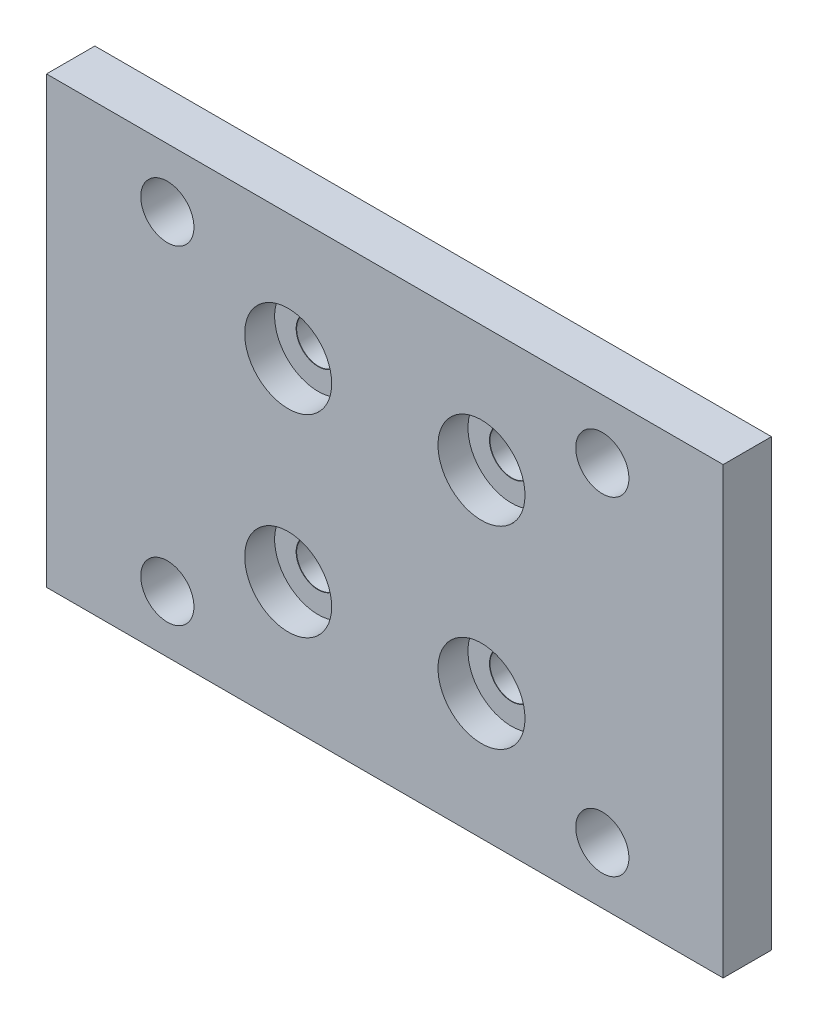
ISO-10303-21;
HEADER;
FILE_DESCRIPTION(('STEP AP214'),'2;1');
FILE_NAME('part.step','',(''),(''),'','','');
FILE_SCHEMA(('AUTOMOTIVE_DESIGN { 1 0 10303 214 1 1 1 1 }'));
ENDSEC;
DATA;
#1=APPLICATION_CONTEXT('core data for automotive mechanical design processes');
#2=APPLICATION_PROTOCOL_DEFINITION('international standard','automotive_design',2000,#1);
#3=PRODUCT_CONTEXT('',#1,'mechanical');
#4=PRODUCT('Part','Part','',(#3));
#5=PRODUCT_RELATED_PRODUCT_CATEGORY('part','',(#4));
#6=PRODUCT_DEFINITION_FORMATION('','',#4);
#7=PRODUCT_DEFINITION_CONTEXT('part definition',#1,'design');
#8=PRODUCT_DEFINITION('design','',#6,#7);
#9=PRODUCT_DEFINITION_SHAPE('','',#8);
#10=(LENGTH_UNIT() NAMED_UNIT(*) SI_UNIT(.MILLI.,.METRE.));
#11=(NAMED_UNIT(*) PLANE_ANGLE_UNIT() SI_UNIT($,.RADIAN.));
#12=(NAMED_UNIT(*) SI_UNIT($,.STERADIAN.) SOLID_ANGLE_UNIT());
#13=UNCERTAINTY_MEASURE_WITH_UNIT(LENGTH_MEASURE(1.E-05),#10,'distance_accuracy_value','');
#14=(GEOMETRIC_REPRESENTATION_CONTEXT(3) GLOBAL_UNCERTAINTY_ASSIGNED_CONTEXT((#13)) GLOBAL_UNIT_ASSIGNED_CONTEXT((#10,
#11,#12)) REPRESENTATION_CONTEXT('',''));
#15=CARTESIAN_POINT('',(0.,0.,0.));
#16=DIRECTION('',(0.,0.,1.));
#17=DIRECTION('',(1.,0.,0.));
#18=AXIS2_PLACEMENT_3D('',#15,#16,#17);
#19=CARTESIAN_POINT('',(35.,-23.,5.));
#20=DIRECTION('',(-1.,0.,0.));
#21=DIRECTION('',(0.,0.,1.));
#22=AXIS2_PLACEMENT_3D('',#19,#20,#21);
#23=PLANE('',#22);
#24=DIRECTION('',(0.,1.,0.));
#25=VECTOR('',#24,1.);
#26=CARTESIAN_POINT('',(35.,-23.,0.));
#27=LINE('',#26,#25);
#28=CARTESIAN_POINT('',(35.,-23.,0.));
#29=VERTEX_POINT('',#28);
#30=CARTESIAN_POINT('',(35.,23.,0.));
#31=VERTEX_POINT('',#30);
#32=EDGE_CURVE('E97',#29,#31,#27,.T.);
#33=ORIENTED_EDGE('',*,*,#32,.T.);
#34=DIRECTION('',(0.,0.,-1.));
#35=VECTOR('',#34,1.);
#36=CARTESIAN_POINT('',(35.,23.,5.));
#37=LINE('',#36,#35);
#38=CARTESIAN_POINT('',(35.,23.,5.));
#39=VERTEX_POINT('',#38);
#40=EDGE_CURVE('E11',#39,#31,#37,.T.);
#41=ORIENTED_EDGE('',*,*,#40,.F.);
#42=DIRECTION('',(0.,1.,0.));
#43=VECTOR('',#42,1.);
#44=CARTESIAN_POINT('',(35.,-23.,5.));
#45=LINE('',#44,#43);
#46=CARTESIAN_POINT('',(35.,-23.,5.));
#47=VERTEX_POINT('',#46);
#48=EDGE_CURVE('E85',#47,#39,#45,.T.);
#49=ORIENTED_EDGE('',*,*,#48,.F.);
#50=DIRECTION('',(0.,0.,-1.));
#51=VECTOR('',#50,1.);
#52=CARTESIAN_POINT('',(35.,-23.,5.));
#53=LINE('',#52,#51);
#54=EDGE_CURVE('E93',#47,#29,#53,.T.);
#55=ORIENTED_EDGE('',*,*,#54,.T.);
#56=EDGE_LOOP('',(#33,#41,#49,#55));
#57=FACE_BOUND('',#56,.T.);
#58=ADVANCED_FACE('F34',(#57),#23,.F.);
#59=CARTESIAN_POINT('',(-35.,23.,5.));
#60=DIRECTION('',(0.,-1.,0.));
#61=DIRECTION('',(0.,0.,-1.));
#62=AXIS2_PLACEMENT_3D('',#59,#60,#61);
#63=PLANE('',#62);
#64=DIRECTION('',(-1.,0.,0.));
#65=VECTOR('',#64,1.);
#66=CARTESIAN_POINT('',(-35.,23.,0.));
#67=LINE('',#66,#65);
#68=CARTESIAN_POINT('',(-35.,23.,0.));
#69=VERTEX_POINT('',#68);
#70=EDGE_CURVE('E89',#31,#69,#67,.T.);
#71=ORIENTED_EDGE('',*,*,#70,.T.);
#72=DIRECTION('',(0.,0.,-1.));
#73=VECTOR('',#72,1.);
#74=CARTESIAN_POINT('',(-35.,23.,5.));
#75=LINE('',#74,#73);
#76=CARTESIAN_POINT('',(-35.,23.,5.));
#77=VERTEX_POINT('',#76);
#78=EDGE_CURVE('E42',#77,#69,#75,.T.);
#79=ORIENTED_EDGE('',*,*,#78,.F.);
#80=DIRECTION('',(-1.,0.,0.));
#81=VECTOR('',#80,1.);
#82=CARTESIAN_POINT('',(-35.,23.,5.));
#83=LINE('',#82,#81);
#84=EDGE_CURVE('E80',#39,#77,#83,.T.);
#85=ORIENTED_EDGE('',*,*,#84,.F.);
#86=ORIENTED_EDGE('',*,*,#40,.T.);
#87=EDGE_LOOP('',(#71,#79,#85,#86));
#88=FACE_BOUND('',#87,.T.);
#89=ADVANCED_FACE('F88',(#88),#63,.F.);
#90=CARTESIAN_POINT('',(-35.,-23.,5.));
#91=DIRECTION('',(1.,0.,0.));
#92=DIRECTION('',(0.,0.,-1.));
#93=AXIS2_PLACEMENT_3D('',#90,#91,#92);
#94=PLANE('',#93);
#95=DIRECTION('',(0.,-1.,0.));
#96=VECTOR('',#95,1.);
#97=CARTESIAN_POINT('',(-35.,-23.,0.));
#98=LINE('',#97,#96);
#99=CARTESIAN_POINT('',(-35.,-23.,0.));
#100=VERTEX_POINT('',#99);
#101=EDGE_CURVE('E67',#69,#100,#98,.T.);
#102=ORIENTED_EDGE('',*,*,#101,.T.);
#103=DIRECTION('',(0.,0.,-1.));
#104=VECTOR('',#103,1.);
#105=CARTESIAN_POINT('',(-35.,-23.,5.));
#106=LINE('',#105,#104);
#107=CARTESIAN_POINT('',(-35.,-23.,5.));
#108=VERTEX_POINT('',#107);
#109=EDGE_CURVE('E90',#108,#100,#106,.T.);
#110=ORIENTED_EDGE('',*,*,#109,.F.);
#111=DIRECTION('',(0.,-1.,0.));
#112=VECTOR('',#111,1.);
#113=CARTESIAN_POINT('',(-35.,-23.,5.));
#114=LINE('',#113,#112);
#115=EDGE_CURVE('E83',#77,#108,#114,.T.);
#116=ORIENTED_EDGE('',*,*,#115,.F.);
#117=ORIENTED_EDGE('',*,*,#78,.T.);
#118=EDGE_LOOP('',(#102,#110,#116,#117));
#119=FACE_BOUND('',#118,.T.);
#120=ADVANCED_FACE('F91',(#119),#94,.F.);
#121=CARTESIAN_POINT('',(-35.,-23.,5.));
#122=DIRECTION('',(0.,1.,0.));
#123=DIRECTION('',(0.,0.,1.));
#124=AXIS2_PLACEMENT_3D('',#121,#122,#123);
#125=PLANE('',#124);
#126=DIRECTION('',(1.,0.,0.));
#127=VECTOR('',#126,1.);
#128=CARTESIAN_POINT('',(-35.,-23.,0.));
#129=LINE('',#128,#127);
#130=EDGE_CURVE('E73',#100,#29,#129,.T.);
#131=ORIENTED_EDGE('',*,*,#130,.T.);
#132=ORIENTED_EDGE('',*,*,#54,.F.);
#133=DIRECTION('',(1.,0.,0.));
#134=VECTOR('',#133,1.);
#135=CARTESIAN_POINT('',(-35.,-23.,5.));
#136=LINE('',#135,#134);
#137=EDGE_CURVE('E50',#108,#47,#136,.T.);
#138=ORIENTED_EDGE('',*,*,#137,.F.);
#139=ORIENTED_EDGE('',*,*,#109,.T.);
#140=EDGE_LOOP('',(#131,#132,#138,#139));
#141=FACE_BOUND('',#140,.T.);
#142=ADVANCED_FACE('F105',(#141),#125,.F.);
#143=CARTESIAN_POINT('',(0.,0.,5.));
#144=DIRECTION('',(0.,0.,-1.));
#145=DIRECTION('',(-1.,0.,0.));
#146=AXIS2_PLACEMENT_3D('',#143,#144,#145);
#147=PLANE('',#146);
#148=CARTESIAN_POINT('',(-9.99999999999564,-10.0000000000003,5.));
#149=DIRECTION('',(0.,0.,1.));
#150=DIRECTION('',(1.,0.,0.));
#151=AXIS2_PLACEMENT_3D('',#148,#149,#150);
#152=CIRCLE('',#151,4.49999999999999);
#153=CARTESIAN_POINT('',(-5.49999999999564,-10.0000000000003,5.));
#154=VERTEX_POINT('',#153);
#155=EDGE_CURVE('E191',#154,#154,#152,.T.);
#156=ORIENTED_EDGE('',*,*,#155,.F.);
#157=EDGE_LOOP('',(#156));
#158=FACE_BOUND('',#157,.T.);
#159=CARTESIAN_POINT('',(-9.99999999999583,9.99999999999973,5.));
#160=DIRECTION('',(0.,0.,1.));
#161=DIRECTION('',(1.,0.,0.));
#162=AXIS2_PLACEMENT_3D('',#159,#160,#161);
#163=CIRCLE('',#162,4.49999999999999);
#164=CARTESIAN_POINT('',(-5.49999999999584,9.99999999999973,5.));
#165=VERTEX_POINT('',#164);
#166=EDGE_CURVE('E179',#165,#165,#163,.T.);
#167=ORIENTED_EDGE('',*,*,#166,.F.);
#168=EDGE_LOOP('',(#167));
#169=FACE_BOUND('',#168,.T.);
#170=CARTESIAN_POINT('',(10.0000000000042,9.99999999999992,5.));
#171=DIRECTION('',(0.,0.,1.));
#172=DIRECTION('',(1.,0.,0.));
#173=AXIS2_PLACEMENT_3D('',#170,#171,#172);
#174=CIRCLE('',#173,4.49999999999999);
#175=CARTESIAN_POINT('',(14.5000000000042,9.99999999999992,5.));
#176=VERTEX_POINT('',#175);
#177=EDGE_CURVE('E167',#176,#176,#174,.T.);
#178=ORIENTED_EDGE('',*,*,#177,.F.);
#179=EDGE_LOOP('',(#178));
#180=FACE_BOUND('',#179,.T.);
#181=CARTESIAN_POINT('',(10.0000000000044,-10.0000000000001,5.));
#182=DIRECTION('',(0.,0.,1.));
#183=DIRECTION('',(1.,0.,0.));
#184=AXIS2_PLACEMENT_3D('',#181,#182,#183);
#185=CIRCLE('',#184,4.49999999999999);
#186=CARTESIAN_POINT('',(14.5000000000044,-10.0000000000001,5.));
#187=VERTEX_POINT('',#186);
#188=EDGE_CURVE('E155',#187,#187,#185,.T.);
#189=ORIENTED_EDGE('',*,*,#188,.F.);
#190=EDGE_LOOP('',(#189));
#191=FACE_BOUND('',#190,.T.);
#192=CARTESIAN_POINT('',(22.5000000000002,-17.1164265716955,5.));
#193=DIRECTION('',(0.,0.,1.));
#194=DIRECTION('',(1.,0.,0.));
#195=AXIS2_PLACEMENT_3D('',#192,#193,#194);
#196=CIRCLE('',#195,2.75);
#197=CARTESIAN_POINT('',(25.2500000000002,-17.1164265716955,5.));
#198=VERTEX_POINT('',#197);
#199=EDGE_CURVE('E131',#198,#198,#196,.T.);
#200=ORIENTED_EDGE('',*,*,#199,.F.);
#201=EDGE_LOOP('',(#200));
#202=FACE_BOUND('',#201,.T.);
#203=CARTESIAN_POINT('',(22.5000000000002,16.8835734283045,5.));
#204=DIRECTION('',(0.,0.,1.));
#205=DIRECTION('',(1.,0.,0.));
#206=AXIS2_PLACEMENT_3D('',#203,#204,#205);
#207=CIRCLE('',#206,2.75);
#208=CARTESIAN_POINT('',(25.2500000000002,16.8835734283045,5.));
#209=VERTEX_POINT('',#208);
#210=EDGE_CURVE('E125',#209,#209,#207,.T.);
#211=ORIENTED_EDGE('',*,*,#210,.F.);
#212=EDGE_LOOP('',(#211));
#213=FACE_BOUND('',#212,.T.);
#214=CARTESIAN_POINT('',(-22.4999999999997,16.8835734283045,5.));
#215=DIRECTION('',(0.,0.,1.));
#216=DIRECTION('',(1.,0.,0.));
#217=AXIS2_PLACEMENT_3D('',#214,#215,#216);
#218=CIRCLE('',#217,2.75);
#219=CARTESIAN_POINT('',(-19.7499999999997,16.8835734283045,5.));
#220=VERTEX_POINT('',#219);
#221=EDGE_CURVE('E119',#220,#220,#218,.T.);
#222=ORIENTED_EDGE('',*,*,#221,.F.);
#223=EDGE_LOOP('',(#222));
#224=FACE_BOUND('',#223,.T.);
#225=CARTESIAN_POINT('',(-22.4999999999997,-17.1164265716955,5.));
#226=DIRECTION('',(0.,0.,1.));
#227=DIRECTION('',(1.,0.,0.));
#228=AXIS2_PLACEMENT_3D('',#225,#226,#227);
#229=CIRCLE('',#228,2.75);
#230=CARTESIAN_POINT('',(-19.7499999999997,-17.1164265716955,5.));
#231=VERTEX_POINT('',#230);
#232=EDGE_CURVE('E113',#231,#231,#229,.T.);
#233=ORIENTED_EDGE('',*,*,#232,.F.);
#234=EDGE_LOOP('',(#233));
#235=FACE_BOUND('',#234,.T.);
#236=ORIENTED_EDGE('',*,*,#48,.T.);
#237=ORIENTED_EDGE('',*,*,#84,.T.);
#238=ORIENTED_EDGE('',*,*,#115,.T.);
#239=ORIENTED_EDGE('',*,*,#137,.T.);
#240=EDGE_LOOP('',(#236,#237,#238,#239));
#241=FACE_BOUND('',#240,.T.);
#242=ADVANCED_FACE('F81',(#158,#169,#180,#191,#202,#213,#224,#235,#241),#147,.F.);
#243=CARTESIAN_POINT('',(0.,0.,0.));
#244=DIRECTION('',(0.,0.,-1.));
#245=DIRECTION('',(-1.,0.,0.));
#246=AXIS2_PLACEMENT_3D('',#243,#244,#245);
#247=PLANE('',#246);
#248=CARTESIAN_POINT('',(-9.99999999999564,-10.0000000000003,0.));
#249=DIRECTION('',(0.,0.,-1.));
#250=DIRECTION('',(-1.,0.,0.));
#251=AXIS2_PLACEMENT_3D('',#248,#249,#250);
#252=CIRCLE('',#251,2.25);
#253=CARTESIAN_POINT('',(-12.2499999999956,-10.0000000000003,0.));
#254=VERTEX_POINT('',#253);
#255=EDGE_CURVE('E143',#254,#254,#252,.T.);
#256=ORIENTED_EDGE('',*,*,#255,.F.);
#257=EDGE_LOOP('',(#256));
#258=FACE_BOUND('',#257,.T.);
#259=CARTESIAN_POINT('',(10.0000000000044,-10.0000000000001,0.));
#260=DIRECTION('',(0.,0.,-1.));
#261=DIRECTION('',(-1.,0.,0.));
#262=AXIS2_PLACEMENT_3D('',#259,#260,#261);
#263=CIRCLE('',#262,2.25);
#264=CARTESIAN_POINT('',(7.75000000000436,-10.0000000000001,0.));
#265=VERTEX_POINT('',#264);
#266=EDGE_CURVE('E140',#265,#265,#263,.T.);
#267=ORIENTED_EDGE('',*,*,#266,.F.);
#268=EDGE_LOOP('',(#267));
#269=FACE_BOUND('',#268,.T.);
#270=CARTESIAN_POINT('',(10.0000000000042,9.99999999999992,0.));
#271=DIRECTION('',(0.,0.,-1.));
#272=DIRECTION('',(-1.,0.,0.));
#273=AXIS2_PLACEMENT_3D('',#270,#271,#272);
#274=CIRCLE('',#273,2.25);
#275=CARTESIAN_POINT('',(7.75000000000416,9.99999999999992,0.));
#276=VERTEX_POINT('',#275);
#277=EDGE_CURVE('E137',#276,#276,#274,.T.);
#278=ORIENTED_EDGE('',*,*,#277,.F.);
#279=EDGE_LOOP('',(#278));
#280=FACE_BOUND('',#279,.T.);
#281=CARTESIAN_POINT('',(-9.99999999999583,9.99999999999973,0.));
#282=DIRECTION('',(0.,0.,-1.));
#283=DIRECTION('',(-1.,0.,0.));
#284=AXIS2_PLACEMENT_3D('',#281,#282,#283);
#285=CIRCLE('',#284,2.25);
#286=CARTESIAN_POINT('',(-12.2499999999958,9.99999999999973,0.));
#287=VERTEX_POINT('',#286);
#288=EDGE_CURVE('E134',#287,#287,#285,.T.);
#289=ORIENTED_EDGE('',*,*,#288,.F.);
#290=EDGE_LOOP('',(#289));
#291=FACE_BOUND('',#290,.T.);
#292=CARTESIAN_POINT('',(22.5000000000002,-17.1164265716955,0.));
#293=DIRECTION('',(0.,0.,1.));
#294=DIRECTION('',(1.,0.,0.));
#295=AXIS2_PLACEMENT_3D('',#292,#293,#294);
#296=CIRCLE('',#295,2.75);
#297=CARTESIAN_POINT('',(25.2500000000002,-17.1164265716955,0.));
#298=VERTEX_POINT('',#297);
#299=EDGE_CURVE('E128',#298,#298,#296,.T.);
#300=ORIENTED_EDGE('',*,*,#299,.T.);
#301=EDGE_LOOP('',(#300));
#302=FACE_BOUND('',#301,.T.);
#303=CARTESIAN_POINT('',(22.5000000000002,16.8835734283045,0.));
#304=DIRECTION('',(0.,0.,1.));
#305=DIRECTION('',(1.,0.,0.));
#306=AXIS2_PLACEMENT_3D('',#303,#304,#305);
#307=CIRCLE('',#306,2.75);
#308=CARTESIAN_POINT('',(25.2500000000002,16.8835734283045,0.));
#309=VERTEX_POINT('',#308);
#310=EDGE_CURVE('E122',#309,#309,#307,.T.);
#311=ORIENTED_EDGE('',*,*,#310,.T.);
#312=EDGE_LOOP('',(#311));
#313=FACE_BOUND('',#312,.T.);
#314=CARTESIAN_POINT('',(-22.4999999999997,16.8835734283045,0.));
#315=DIRECTION('',(0.,0.,1.));
#316=DIRECTION('',(1.,0.,0.));
#317=AXIS2_PLACEMENT_3D('',#314,#315,#316);
#318=CIRCLE('',#317,2.75);
#319=CARTESIAN_POINT('',(-19.7499999999997,16.8835734283045,0.));
#320=VERTEX_POINT('',#319);
#321=EDGE_CURVE('E116',#320,#320,#318,.T.);
#322=ORIENTED_EDGE('',*,*,#321,.T.);
#323=EDGE_LOOP('',(#322));
#324=FACE_BOUND('',#323,.T.);
#325=CARTESIAN_POINT('',(-22.4999999999997,-17.1164265716955,0.));
#326=DIRECTION('',(0.,0.,1.));
#327=DIRECTION('',(1.,0.,0.));
#328=AXIS2_PLACEMENT_3D('',#325,#326,#327);
#329=CIRCLE('',#328,2.75);
#330=CARTESIAN_POINT('',(-19.7499999999997,-17.1164265716955,0.));
#331=VERTEX_POINT('',#330);
#332=EDGE_CURVE('E100',#331,#331,#329,.T.);
#333=ORIENTED_EDGE('',*,*,#332,.T.);
#334=EDGE_LOOP('',(#333));
#335=FACE_BOUND('',#334,.T.);
#336=ORIENTED_EDGE('',*,*,#32,.F.);
#337=ORIENTED_EDGE('',*,*,#130,.F.);
#338=ORIENTED_EDGE('',*,*,#101,.F.);
#339=ORIENTED_EDGE('',*,*,#70,.F.);
#340=EDGE_LOOP('',(#336,#337,#338,#339));
#341=FACE_BOUND('',#340,.T.);
#342=ADVANCED_FACE('F108',(#258,#269,#280,#291,#302,#313,#324,#335,#341),#247,.T.);
#343=CARTESIAN_POINT('',(-22.4999999999997,-17.1164265716955,5.));
#344=DIRECTION('',(0.,0.,1.));
#345=DIRECTION('',(1.,0.,0.));
#346=AXIS2_PLACEMENT_3D('',#343,#344,#345);
#347=CYLINDRICAL_SURFACE('',#346,2.75);
#348=ORIENTED_EDGE('',*,*,#332,.F.);
#349=EDGE_LOOP('',(#348));
#350=FACE_BOUND('',#349,.T.);
#351=ORIENTED_EDGE('',*,*,#232,.T.);
#352=EDGE_LOOP('',(#351));
#353=FACE_BOUND('',#352,.T.);
#354=ADVANCED_FACE('F214',(#350,#353),#347,.F.);
#355=CARTESIAN_POINT('',(-22.4999999999997,16.8835734283045,5.));
#356=DIRECTION('',(0.,0.,1.));
#357=DIRECTION('',(1.,0.,0.));
#358=AXIS2_PLACEMENT_3D('',#355,#356,#357);
#359=CYLINDRICAL_SURFACE('',#358,2.75);
#360=ORIENTED_EDGE('',*,*,#321,.F.);
#361=EDGE_LOOP('',(#360));
#362=FACE_BOUND('',#361,.T.);
#363=ORIENTED_EDGE('',*,*,#221,.T.);
#364=EDGE_LOOP('',(#363));
#365=FACE_BOUND('',#364,.T.);
#366=ADVANCED_FACE('F216',(#362,#365),#359,.F.);
#367=CARTESIAN_POINT('',(22.5000000000002,16.8835734283045,5.));
#368=DIRECTION('',(0.,0.,1.));
#369=DIRECTION('',(1.,0.,0.));
#370=AXIS2_PLACEMENT_3D('',#367,#368,#369);
#371=CYLINDRICAL_SURFACE('',#370,2.75);
#372=ORIENTED_EDGE('',*,*,#310,.F.);
#373=EDGE_LOOP('',(#372));
#374=FACE_BOUND('',#373,.T.);
#375=ORIENTED_EDGE('',*,*,#210,.T.);
#376=EDGE_LOOP('',(#375));
#377=FACE_BOUND('',#376,.T.);
#378=ADVANCED_FACE('F223',(#374,#377),#371,.F.);
#379=CARTESIAN_POINT('',(22.5000000000002,-17.1164265716955,5.));
#380=DIRECTION('',(0.,0.,1.));
#381=DIRECTION('',(1.,0.,0.));
#382=AXIS2_PLACEMENT_3D('',#379,#380,#381);
#383=CYLINDRICAL_SURFACE('',#382,2.75);
#384=ORIENTED_EDGE('',*,*,#299,.F.);
#385=EDGE_LOOP('',(#384));
#386=FACE_BOUND('',#385,.T.);
#387=ORIENTED_EDGE('',*,*,#199,.T.);
#388=EDGE_LOOP('',(#387));
#389=FACE_BOUND('',#388,.T.);
#390=ADVANCED_FACE('F258',(#386,#389),#383,.F.);
#391=CARTESIAN_POINT('',(-9.99999999999583,9.99999999999973,0.));
#392=DIRECTION('',(0.,0.,-1.));
#393=DIRECTION('',(-1.,0.,0.));
#394=AXIS2_PLACEMENT_3D('',#391,#392,#393);
#395=CYLINDRICAL_SURFACE('',#394,2.25);
#396=CARTESIAN_POINT('',(-9.99999999999583,9.99999999999973,1.875));
#397=DIRECTION('',(0.,0.,1.));
#398=DIRECTION('',(1.,0.,0.));
#399=AXIS2_PLACEMENT_3D('',#396,#397,#398);
#400=CIRCLE('',#399,2.25);
#401=CARTESIAN_POINT('',(-7.74999999999583,9.99999999999973,1.875));
#402=VERTEX_POINT('',#401);
#403=EDGE_CURVE('E170',#402,#402,#400,.T.);
#404=ORIENTED_EDGE('',*,*,#403,.T.);
#405=EDGE_LOOP('',(#404));
#406=FACE_BOUND('',#405,.T.);
#407=ORIENTED_EDGE('',*,*,#288,.T.);
#408=EDGE_LOOP('',(#407));
#409=FACE_BOUND('',#408,.T.);
#410=ADVANCED_FACE('F263',(#406,#409),#395,.F.);
#411=CARTESIAN_POINT('',(10.0000000000042,9.99999999999992,0.));
#412=DIRECTION('',(0.,0.,-1.));
#413=DIRECTION('',(-1.,0.,0.));
#414=AXIS2_PLACEMENT_3D('',#411,#412,#413);
#415=CYLINDRICAL_SURFACE('',#414,2.25);
#416=CARTESIAN_POINT('',(10.0000000000042,9.99999999999992,1.875));
#417=DIRECTION('',(0.,0.,1.));
#418=DIRECTION('',(1.,0.,0.));
#419=AXIS2_PLACEMENT_3D('',#416,#417,#418);
#420=CIRCLE('',#419,2.25);
#421=CARTESIAN_POINT('',(12.2500000000042,9.99999999999992,1.875));
#422=VERTEX_POINT('',#421);
#423=EDGE_CURVE('E158',#422,#422,#420,.T.);
#424=ORIENTED_EDGE('',*,*,#423,.T.);
#425=EDGE_LOOP('',(#424));
#426=FACE_BOUND('',#425,.T.);
#427=ORIENTED_EDGE('',*,*,#277,.T.);
#428=EDGE_LOOP('',(#427));
#429=FACE_BOUND('',#428,.T.);
#430=ADVANCED_FACE('F292',(#426,#429),#415,.F.);
#431=CARTESIAN_POINT('',(10.0000000000044,-10.0000000000001,0.));
#432=DIRECTION('',(0.,0.,-1.));
#433=DIRECTION('',(-1.,0.,0.));
#434=AXIS2_PLACEMENT_3D('',#431,#432,#433);
#435=CYLINDRICAL_SURFACE('',#434,2.25);
#436=CARTESIAN_POINT('',(10.0000000000044,-10.0000000000001,1.875));
#437=DIRECTION('',(0.,0.,1.));
#438=DIRECTION('',(1.,0.,0.));
#439=AXIS2_PLACEMENT_3D('',#436,#437,#438);
#440=CIRCLE('',#439,2.25);
#441=CARTESIAN_POINT('',(12.2500000000044,-10.0000000000001,1.875));
#442=VERTEX_POINT('',#441);
#443=EDGE_CURVE('E146',#442,#442,#440,.T.);
#444=ORIENTED_EDGE('',*,*,#443,.T.);
#445=EDGE_LOOP('',(#444));
#446=FACE_BOUND('',#445,.T.);
#447=ORIENTED_EDGE('',*,*,#266,.T.);
#448=EDGE_LOOP('',(#447));
#449=FACE_BOUND('',#448,.T.);
#450=ADVANCED_FACE('F296',(#446,#449),#435,.F.);
#451=CARTESIAN_POINT('',(-9.99999999999564,-10.0000000000003,0.));
#452=DIRECTION('',(0.,0.,-1.));
#453=DIRECTION('',(-1.,0.,0.));
#454=AXIS2_PLACEMENT_3D('',#451,#452,#453);
#455=CYLINDRICAL_SURFACE('',#454,2.25);
#456=CARTESIAN_POINT('',(-9.99999999999564,-10.0000000000003,1.875));
#457=DIRECTION('',(0.,0.,1.));
#458=DIRECTION('',(1.,0.,0.));
#459=AXIS2_PLACEMENT_3D('',#456,#457,#458);
#460=CIRCLE('',#459,2.25);
#461=CARTESIAN_POINT('',(-7.74999999999564,-10.0000000000003,1.875));
#462=VERTEX_POINT('',#461);
#463=EDGE_CURVE('E182',#462,#462,#460,.T.);
#464=ORIENTED_EDGE('',*,*,#463,.T.);
#465=EDGE_LOOP('',(#464));
#466=FACE_BOUND('',#465,.T.);
#467=ORIENTED_EDGE('',*,*,#255,.T.);
#468=EDGE_LOOP('',(#467));
#469=FACE_BOUND('',#468,.T.);
#470=ADVANCED_FACE('F300',(#466,#469),#455,.F.);
#471=CARTESIAN_POINT('',(10.0000000000044,-10.0000000000001,1.9));
#472=DIRECTION('',(0.,0.,1.));
#473=DIRECTION('',(1.,0.,0.));
#474=AXIS2_PLACEMENT_3D('',#471,#472,#473);
#475=CONICAL_SURFACE('',#474,2.275,0.785398163397483);
#476=ORIENTED_EDGE('',*,*,#443,.F.);
#477=EDGE_LOOP('',(#476));
#478=FACE_BOUND('',#477,.T.);
#479=CARTESIAN_POINT('',(10.0000000000044,-10.0000000000001,1.9));
#480=DIRECTION('',(0.,0.,1.));
#481=DIRECTION('',(1.,0.,0.));
#482=AXIS2_PLACEMENT_3D('',#479,#480,#481);
#483=CIRCLE('',#482,2.275);
#484=CARTESIAN_POINT('',(12.2750000000044,-10.0000000000001,1.9));
#485=VERTEX_POINT('',#484);
#486=EDGE_CURVE('E149',#485,#485,#483,.T.);
#487=ORIENTED_EDGE('',*,*,#486,.T.);
#488=EDGE_LOOP('',(#487));
#489=FACE_BOUND('',#488,.T.);
#490=ADVANCED_FACE('F304',(#478,#489),#475,.F.);
#491=CARTESIAN_POINT('',(12.2750000000044,-10.0000000000001,1.9));
#492=DIRECTION('',(0.,0.,-1.));
#493=DIRECTION('',(-1.,0.,0.));
#494=AXIS2_PLACEMENT_3D('',#491,#492,#493);
#495=PLANE('',#494);
#496=ORIENTED_EDGE('',*,*,#486,.F.);
#497=EDGE_LOOP('',(#496));
#498=FACE_BOUND('',#497,.T.);
#499=CARTESIAN_POINT('',(10.0000000000044,-10.0000000000001,1.9));
#500=DIRECTION('',(0.,0.,1.));
#501=DIRECTION('',(1.,0.,0.));
#502=AXIS2_PLACEMENT_3D('',#499,#500,#501);
#503=CIRCLE('',#502,4.49999999999999);
#504=CARTESIAN_POINT('',(14.5000000000044,-10.0000000000001,1.9));
#505=VERTEX_POINT('',#504);
#506=EDGE_CURVE('E152',#505,#505,#503,.T.);
#507=ORIENTED_EDGE('',*,*,#506,.T.);
#508=EDGE_LOOP('',(#507));
#509=FACE_BOUND('',#508,.T.);
#510=ADVANCED_FACE('F308',(#498,#509),#495,.F.);
#511=CARTESIAN_POINT('',(10.0000000000044,-10.0000000000001,5.));
#512=DIRECTION('',(0.,0.,1.));
#513=DIRECTION('',(1.,0.,0.));
#514=AXIS2_PLACEMENT_3D('',#511,#512,#513);
#515=CYLINDRICAL_SURFACE('',#514,4.49999999999999);
#516=ORIENTED_EDGE('',*,*,#506,.F.);
#517=EDGE_LOOP('',(#516));
#518=FACE_BOUND('',#517,.T.);
#519=ORIENTED_EDGE('',*,*,#188,.T.);
#520=EDGE_LOOP('',(#519));
#521=FACE_BOUND('',#520,.T.);
#522=ADVANCED_FACE('F312',(#518,#521),#515,.F.);
#523=CARTESIAN_POINT('',(10.0000000000042,9.99999999999992,1.9));
#524=DIRECTION('',(0.,0.,1.));
#525=DIRECTION('',(1.,0.,0.));
#526=AXIS2_PLACEMENT_3D('',#523,#524,#525);
#527=CONICAL_SURFACE('',#526,2.275,0.785398163397483);
#528=ORIENTED_EDGE('',*,*,#423,.F.);
#529=EDGE_LOOP('',(#528));
#530=FACE_BOUND('',#529,.T.);
#531=CARTESIAN_POINT('',(10.0000000000042,9.99999999999992,1.9));
#532=DIRECTION('',(0.,0.,1.));
#533=DIRECTION('',(1.,0.,0.));
#534=AXIS2_PLACEMENT_3D('',#531,#532,#533);
#535=CIRCLE('',#534,2.275);
#536=CARTESIAN_POINT('',(12.2750000000042,9.99999999999992,1.9));
#537=VERTEX_POINT('',#536);
#538=EDGE_CURVE('E161',#537,#537,#535,.T.);
#539=ORIENTED_EDGE('',*,*,#538,.T.);
#540=EDGE_LOOP('',(#539));
#541=FACE_BOUND('',#540,.T.);
#542=ADVANCED_FACE('F316',(#530,#541),#527,.F.);
#543=CARTESIAN_POINT('',(12.2750000000042,9.99999999999992,1.9));
#544=DIRECTION('',(0.,0.,-1.));
#545=DIRECTION('',(-1.,0.,0.));
#546=AXIS2_PLACEMENT_3D('',#543,#544,#545);
#547=PLANE('',#546);
#548=ORIENTED_EDGE('',*,*,#538,.F.);
#549=EDGE_LOOP('',(#548));
#550=FACE_BOUND('',#549,.T.);
#551=CARTESIAN_POINT('',(10.0000000000042,9.99999999999992,1.9));
#552=DIRECTION('',(0.,0.,1.));
#553=DIRECTION('',(1.,0.,0.));
#554=AXIS2_PLACEMENT_3D('',#551,#552,#553);
#555=CIRCLE('',#554,4.49999999999999);
#556=CARTESIAN_POINT('',(14.5000000000042,9.99999999999992,1.9));
#557=VERTEX_POINT('',#556);
#558=EDGE_CURVE('E164',#557,#557,#555,.T.);
#559=ORIENTED_EDGE('',*,*,#558,.T.);
#560=EDGE_LOOP('',(#559));
#561=FACE_BOUND('',#560,.T.);
#562=ADVANCED_FACE('F320',(#550,#561),#547,.F.);
#563=CARTESIAN_POINT('',(10.0000000000042,9.99999999999992,5.));
#564=DIRECTION('',(0.,0.,1.));
#565=DIRECTION('',(1.,0.,0.));
#566=AXIS2_PLACEMENT_3D('',#563,#564,#565);
#567=CYLINDRICAL_SURFACE('',#566,4.49999999999999);
#568=ORIENTED_EDGE('',*,*,#558,.F.);
#569=EDGE_LOOP('',(#568));
#570=FACE_BOUND('',#569,.T.);
#571=ORIENTED_EDGE('',*,*,#177,.T.);
#572=EDGE_LOOP('',(#571));
#573=FACE_BOUND('',#572,.T.);
#574=ADVANCED_FACE('F324',(#570,#573),#567,.F.);
#575=CARTESIAN_POINT('',(-9.99999999999583,9.99999999999973,1.9));
#576=DIRECTION('',(0.,0.,1.));
#577=DIRECTION('',(1.,0.,0.));
#578=AXIS2_PLACEMENT_3D('',#575,#576,#577);
#579=CONICAL_SURFACE('',#578,2.275,0.785398163397483);
#580=ORIENTED_EDGE('',*,*,#403,.F.);
#581=EDGE_LOOP('',(#580));
#582=FACE_BOUND('',#581,.T.);
#583=CARTESIAN_POINT('',(-9.99999999999583,9.99999999999973,1.9));
#584=DIRECTION('',(0.,0.,1.));
#585=DIRECTION('',(1.,0.,0.));
#586=AXIS2_PLACEMENT_3D('',#583,#584,#585);
#587=CIRCLE('',#586,2.275);
#588=CARTESIAN_POINT('',(-7.72499999999583,9.99999999999973,1.9));
#589=VERTEX_POINT('',#588);
#590=EDGE_CURVE('E173',#589,#589,#587,.T.);
#591=ORIENTED_EDGE('',*,*,#590,.T.);
#592=EDGE_LOOP('',(#591));
#593=FACE_BOUND('',#592,.T.);
#594=ADVANCED_FACE('F328',(#582,#593),#579,.F.);
#595=CARTESIAN_POINT('',(-7.72499999999583,9.99999999999973,1.9));
#596=DIRECTION('',(0.,0.,-1.));
#597=DIRECTION('',(-1.,0.,0.));
#598=AXIS2_PLACEMENT_3D('',#595,#596,#597);
#599=PLANE('',#598);
#600=ORIENTED_EDGE('',*,*,#590,.F.);
#601=EDGE_LOOP('',(#600));
#602=FACE_BOUND('',#601,.T.);
#603=CARTESIAN_POINT('',(-9.99999999999583,9.99999999999973,1.9));
#604=DIRECTION('',(0.,0.,1.));
#605=DIRECTION('',(1.,0.,0.));
#606=AXIS2_PLACEMENT_3D('',#603,#604,#605);
#607=CIRCLE('',#606,4.49999999999999);
#608=CARTESIAN_POINT('',(-5.49999999999584,9.99999999999973,1.9));
#609=VERTEX_POINT('',#608);
#610=EDGE_CURVE('E176',#609,#609,#607,.T.);
#611=ORIENTED_EDGE('',*,*,#610,.T.);
#612=EDGE_LOOP('',(#611));
#613=FACE_BOUND('',#612,.T.);
#614=ADVANCED_FACE('F332',(#602,#613),#599,.F.);
#615=CARTESIAN_POINT('',(-9.99999999999583,9.99999999999973,5.));
#616=DIRECTION('',(0.,0.,1.));
#617=DIRECTION('',(1.,0.,0.));
#618=AXIS2_PLACEMENT_3D('',#615,#616,#617);
#619=CYLINDRICAL_SURFACE('',#618,4.49999999999999);
#620=ORIENTED_EDGE('',*,*,#610,.F.);
#621=EDGE_LOOP('',(#620));
#622=FACE_BOUND('',#621,.T.);
#623=ORIENTED_EDGE('',*,*,#166,.T.);
#624=EDGE_LOOP('',(#623));
#625=FACE_BOUND('',#624,.T.);
#626=ADVANCED_FACE('F336',(#622,#625),#619,.F.);
#627=CARTESIAN_POINT('',(-9.99999999999564,-10.0000000000003,1.9));
#628=DIRECTION('',(0.,0.,1.));
#629=DIRECTION('',(1.,0.,0.));
#630=AXIS2_PLACEMENT_3D('',#627,#628,#629);
#631=CONICAL_SURFACE('',#630,2.275,0.785398163397483);
#632=ORIENTED_EDGE('',*,*,#463,.F.);
#633=EDGE_LOOP('',(#632));
#634=FACE_BOUND('',#633,.T.);
#635=CARTESIAN_POINT('',(-9.99999999999564,-10.0000000000003,1.9));
#636=DIRECTION('',(0.,0.,1.));
#637=DIRECTION('',(1.,0.,0.));
#638=AXIS2_PLACEMENT_3D('',#635,#636,#637);
#639=CIRCLE('',#638,2.275);
#640=CARTESIAN_POINT('',(-7.72499999999564,-10.0000000000003,1.9));
#641=VERTEX_POINT('',#640);
#642=EDGE_CURVE('E185',#641,#641,#639,.T.);
#643=ORIENTED_EDGE('',*,*,#642,.T.);
#644=EDGE_LOOP('',(#643));
#645=FACE_BOUND('',#644,.T.);
#646=ADVANCED_FACE('F340',(#634,#645),#631,.F.);
#647=CARTESIAN_POINT('',(-7.72499999999564,-10.0000000000003,1.9));
#648=DIRECTION('',(0.,0.,-1.));
#649=DIRECTION('',(-1.,0.,0.));
#650=AXIS2_PLACEMENT_3D('',#647,#648,#649);
#651=PLANE('',#650);
#652=ORIENTED_EDGE('',*,*,#642,.F.);
#653=EDGE_LOOP('',(#652));
#654=FACE_BOUND('',#653,.T.);
#655=CARTESIAN_POINT('',(-9.99999999999564,-10.0000000000003,1.9));
#656=DIRECTION('',(0.,0.,1.));
#657=DIRECTION('',(1.,0.,0.));
#658=AXIS2_PLACEMENT_3D('',#655,#656,#657);
#659=CIRCLE('',#658,4.49999999999999);
#660=CARTESIAN_POINT('',(-5.49999999999564,-10.0000000000003,1.9));
#661=VERTEX_POINT('',#660);
#662=EDGE_CURVE('E188',#661,#661,#659,.T.);
#663=ORIENTED_EDGE('',*,*,#662,.T.);
#664=EDGE_LOOP('',(#663));
#665=FACE_BOUND('',#664,.T.);
#666=ADVANCED_FACE('F344',(#654,#665),#651,.F.);
#667=CARTESIAN_POINT('',(-9.99999999999564,-10.0000000000003,5.));
#668=DIRECTION('',(0.,0.,1.));
#669=DIRECTION('',(1.,0.,0.));
#670=AXIS2_PLACEMENT_3D('',#667,#668,#669);
#671=CYLINDRICAL_SURFACE('',#670,4.49999999999999);
#672=ORIENTED_EDGE('',*,*,#662,.F.);
#673=EDGE_LOOP('',(#672));
#674=FACE_BOUND('',#673,.T.);
#675=ORIENTED_EDGE('',*,*,#155,.T.);
#676=EDGE_LOOP('',(#675));
#677=FACE_BOUND('',#676,.T.);
#678=ADVANCED_FACE('F195',(#674,#677),#671,.F.);
#679=CLOSED_SHELL('',(#58,#89,#120,#142,#242,#342,#354,#366,#378,#390,#410,#430,#450,#470,#490,
#510,#522,#542,#562,#574,#594,#614,#626,#646,#666,#678));
#680=MANIFOLD_SOLID_BREP('B2',#679);
#681=ADVANCED_BREP_SHAPE_REPRESENTATION('',(#18,#680),#14);
#682=SHAPE_DEFINITION_REPRESENTATION(#9,#681);
ENDSEC;
END-ISO-10303-21;
